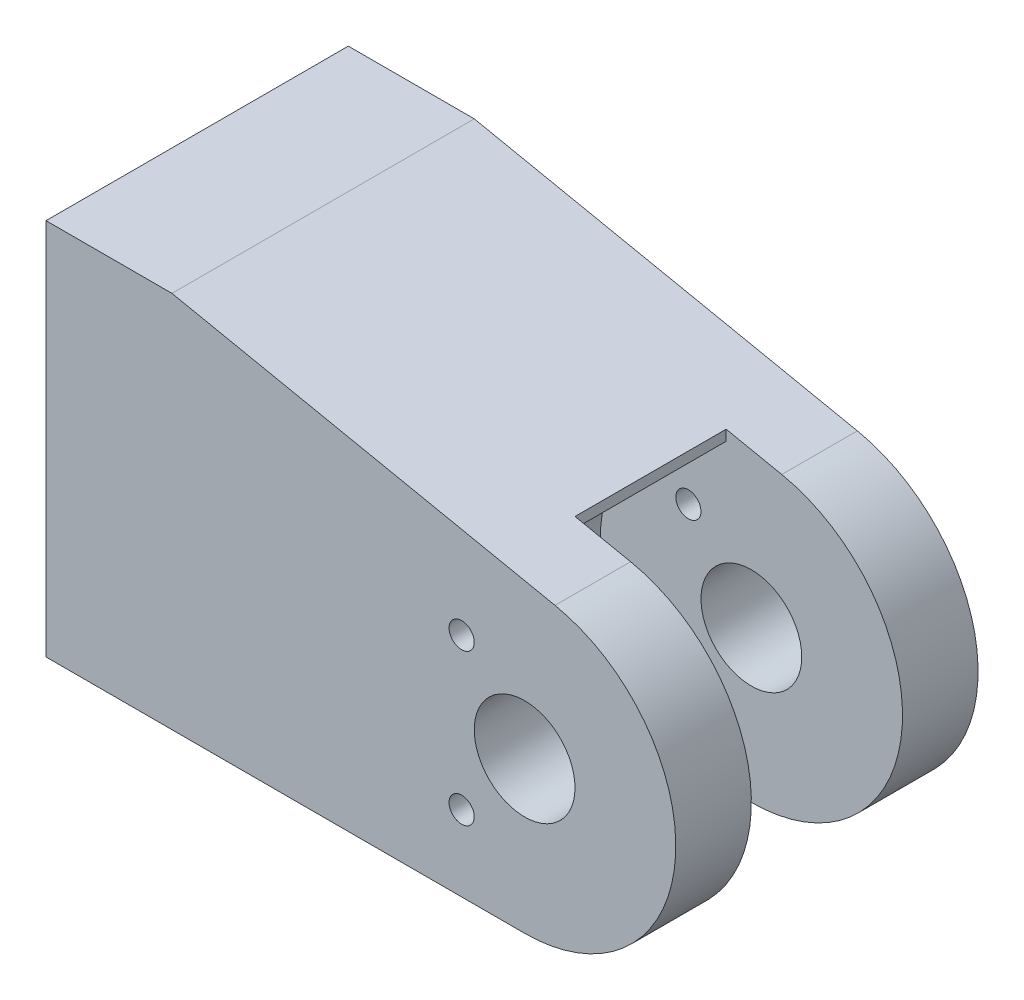
ISO-10303-21;
HEADER;
FILE_DESCRIPTION(('STEP AP214'),'2;1');
FILE_NAME('part.step','',(''),(''),'','','');
FILE_SCHEMA(('AUTOMOTIVE_DESIGN { 1 0 10303 214 1 1 1 1 }'));
ENDSEC;
DATA;
#1=APPLICATION_CONTEXT('core data for automotive mechanical design processes');
#2=APPLICATION_PROTOCOL_DEFINITION('international standard','automotive_design',2000,#1);
#3=PRODUCT_CONTEXT('',#1,'mechanical');
#4=PRODUCT('Part','Part','',(#3));
#5=PRODUCT_RELATED_PRODUCT_CATEGORY('part','',(#4));
#6=PRODUCT_DEFINITION_FORMATION('','',#4);
#7=PRODUCT_DEFINITION_CONTEXT('part definition',#1,'design');
#8=PRODUCT_DEFINITION('design','',#6,#7);
#9=PRODUCT_DEFINITION_SHAPE('','',#8);
#10=(LENGTH_UNIT() NAMED_UNIT(*) SI_UNIT(.MILLI.,.METRE.));
#11=(NAMED_UNIT(*) PLANE_ANGLE_UNIT() SI_UNIT($,.RADIAN.));
#12=(NAMED_UNIT(*) SI_UNIT($,.STERADIAN.) SOLID_ANGLE_UNIT());
#13=UNCERTAINTY_MEASURE_WITH_UNIT(LENGTH_MEASURE(1.E-05),#10,'distance_accuracy_value','');
#14=(GEOMETRIC_REPRESENTATION_CONTEXT(3) GLOBAL_UNCERTAINTY_ASSIGNED_CONTEXT((#13)) GLOBAL_UNIT_ASSIGNED_CONTEXT((#10,
#11,#12)) REPRESENTATION_CONTEXT('',''));
#15=CARTESIAN_POINT('',(0.,0.,0.));
#16=DIRECTION('',(0.,0.,1.));
#17=DIRECTION('',(1.,0.,0.));
#18=AXIS2_PLACEMENT_3D('',#15,#16,#17);
#19=CARTESIAN_POINT('',(0.,0.,6.));
#20=DIRECTION('',(0.,1.,0.));
#21=DIRECTION('',(0.,0.,1.));
#22=AXIS2_PLACEMENT_3D('',#19,#20,#21);
#23=PLANE('',#22);
#24=DIRECTION('',(1.,0.,0.));
#25=VECTOR('',#24,1.);
#26=CARTESIAN_POINT('',(18.,0.,-3.));
#27=LINE('',#26,#25);
#28=CARTESIAN_POINT('',(15.,0.,-3.));
#29=VERTEX_POINT('',#28);
#30=CARTESIAN_POINT('',(19.,0.,-3.));
#31=VERTEX_POINT('',#30);
#32=EDGE_CURVE('E161',#29,#31,#27,.T.);
#33=ORIENTED_EDGE('',*,*,#32,.F.);
#34=DIRECTION('',(0.,0.,1.));
#35=VECTOR('',#34,1.);
#36=CARTESIAN_POINT('',(15.,0.,-3.));
#37=LINE('',#36,#35);
#38=CARTESIAN_POINT('',(15.,0.,3.));
#39=VERTEX_POINT('',#38);
#40=EDGE_CURVE('E259',#29,#39,#37,.T.);
#41=ORIENTED_EDGE('',*,*,#40,.T.);
#42=DIRECTION('',(-1.,0.,0.));
#43=VECTOR('',#42,1.);
#44=CARTESIAN_POINT('',(18.,0.,3.));
#45=LINE('',#44,#43);
#46=CARTESIAN_POINT('',(19.,0.,3.));
#47=VERTEX_POINT('',#46);
#48=EDGE_CURVE('E176',#47,#39,#45,.T.);
#49=ORIENTED_EDGE('',*,*,#48,.F.);
#50=DIRECTION('',(0.,0.,-1.));
#51=VECTOR('',#50,1.);
#52=CARTESIAN_POINT('',(19.,0.,6.));
#53=LINE('',#52,#51);
#54=CARTESIAN_POINT('',(19.,0.,6.));
#55=VERTEX_POINT('',#54);
#56=EDGE_CURVE('E46',#55,#47,#53,.T.);
#57=ORIENTED_EDGE('',*,*,#56,.F.);
#58=DIRECTION('',(1.,0.,0.));
#59=VECTOR('',#58,1.);
#60=CARTESIAN_POINT('',(0.,0.,6.));
#61=LINE('',#60,#59);
#62=CARTESIAN_POINT('',(0.,0.,6.));
#63=VERTEX_POINT('',#62);
#64=EDGE_CURVE('E95',#63,#55,#61,.T.);
#65=ORIENTED_EDGE('',*,*,#64,.F.);
#66=DIRECTION('',(0.,0.,-1.));
#67=VECTOR('',#66,1.);
#68=CARTESIAN_POINT('',(0.,0.,6.));
#69=LINE('',#68,#67);
#70=CARTESIAN_POINT('',(0.,0.,-6.));
#71=VERTEX_POINT('',#70);
#72=EDGE_CURVE('E11',#63,#71,#69,.T.);
#73=ORIENTED_EDGE('',*,*,#72,.T.);
#74=DIRECTION('',(1.,0.,0.));
#75=VECTOR('',#74,1.);
#76=CARTESIAN_POINT('',(0.,0.,-6.));
#77=LINE('',#76,#75);
#78=CARTESIAN_POINT('',(19.,0.,-6.));
#79=VERTEX_POINT('',#78);
#80=EDGE_CURVE('E133',#71,#79,#77,.T.);
#81=ORIENTED_EDGE('',*,*,#80,.T.);
#82=EDGE_CURVE('E120',#31,#79,#53,.T.);
#83=ORIENTED_EDGE('',*,*,#82,.F.);
#84=EDGE_LOOP('',(#33,#41,#49,#57,#65,#73,#81,#83));
#85=FACE_BOUND('',#84,.T.);
#86=ADVANCED_FACE('F37',(#85),#23,.F.);
#87=CARTESIAN_POINT('',(19.,6.,6.));
#88=DIRECTION('',(0.,0.,-1.));
#89=DIRECTION('',(-1.,0.,0.));
#90=AXIS2_PLACEMENT_3D('',#87,#88,#89);
#91=CYLINDRICAL_SURFACE('',#90,6.);
#92=CARTESIAN_POINT('',(19.,6.,-3.));
#93=DIRECTION('',(0.,0.,1.));
#94=DIRECTION('',(1.,0.,0.));
#95=AXIS2_PLACEMENT_3D('',#92,#93,#94);
#96=CIRCLE('',#95,6.);
#97=CARTESIAN_POINT('',(20.2068788216536,11.8773670559056,-3.));
#98=VERTEX_POINT('',#97);
#99=EDGE_CURVE('E207',#31,#98,#96,.T.);
#100=ORIENTED_EDGE('',*,*,#99,.F.);
#101=ORIENTED_EDGE('',*,*,#82,.T.);
#102=CARTESIAN_POINT('',(19.,6.,-6.));
#103=DIRECTION('',(0.,0.,1.));
#104=DIRECTION('',(1.,0.,0.));
#105=AXIS2_PLACEMENT_3D('',#102,#103,#104);
#106=CIRCLE('',#105,6.);
#107=CARTESIAN_POINT('',(20.2068788216536,11.8773670559056,-6.));
#108=VERTEX_POINT('',#107);
#109=EDGE_CURVE('E137',#79,#108,#106,.T.);
#110=ORIENTED_EDGE('',*,*,#109,.T.);
#111=DIRECTION('',(0.,0.,-1.));
#112=VECTOR('',#111,1.);
#113=CARTESIAN_POINT('',(20.2068788216536,11.8773670559056,6.));
#114=LINE('',#113,#112);
#115=EDGE_CURVE('E121',#98,#108,#114,.T.);
#116=ORIENTED_EDGE('',*,*,#115,.F.);
#117=EDGE_LOOP('',(#100,#101,#110,#116));
#118=FACE_BOUND('',#117,.T.);
#119=ADVANCED_FACE('F229',(#118),#91,.T.);
#120=CARTESIAN_POINT('',(19.,6.,6.));
#121=DIRECTION('',(0.,0.,-1.));
#122=DIRECTION('',(-1.,0.,0.));
#123=AXIS2_PLACEMENT_3D('',#120,#121,#122);
#124=CYLINDRICAL_SURFACE('',#123,2.);
#125=CARTESIAN_POINT('',(19.,6.,-6.));
#126=DIRECTION('',(0.,0.,1.));
#127=DIRECTION('',(1.,0.,0.));
#128=AXIS2_PLACEMENT_3D('',#125,#126,#127);
#129=CIRCLE('',#128,2.);
#130=CARTESIAN_POINT('',(21.,6.,-6.));
#131=VERTEX_POINT('',#130);
#132=EDGE_CURVE('E153',#131,#131,#129,.T.);
#133=ORIENTED_EDGE('',*,*,#132,.F.);
#134=EDGE_LOOP('',(#133));
#135=FACE_BOUND('',#134,.T.);
#136=CARTESIAN_POINT('',(19.,6.,-3.));
#137=DIRECTION('',(0.,0.,1.));
#138=DIRECTION('',(1.,0.,0.));
#139=AXIS2_PLACEMENT_3D('',#136,#137,#138);
#140=CIRCLE('',#139,2.);
#141=CARTESIAN_POINT('',(21.,6.,-3.));
#142=VERTEX_POINT('',#141);
#143=EDGE_CURVE('E150',#142,#142,#140,.T.);
#144=ORIENTED_EDGE('',*,*,#143,.T.);
#145=EDGE_LOOP('',(#144));
#146=FACE_BOUND('',#145,.T.);
#147=ADVANCED_FACE('F285',(#135,#146),#124,.F.);
#148=CARTESIAN_POINT('',(19.,6.,6.));
#149=DIRECTION('',(0.,0.,1.));
#150=DIRECTION('',(1.,0.,0.));
#151=AXIS2_PLACEMENT_3D('',#148,#149,#150);
#152=PLANE('',#151);
#153=CARTESIAN_POINT('',(16.5,9.,6.));
#154=DIRECTION('',(0.,0.,1.));
#155=DIRECTION('',(1.,0.,0.));
#156=AXIS2_PLACEMENT_3D('',#153,#154,#155);
#157=CIRCLE('',#156,0.499999999999999);
#158=CARTESIAN_POINT('',(17.,9.,6.));
#159=VERTEX_POINT('',#158);
#160=EDGE_CURVE('E271',#159,#159,#157,.T.);
#161=ORIENTED_EDGE('',*,*,#160,.F.);
#162=EDGE_LOOP('',(#161));
#163=FACE_BOUND('',#162,.T.);
#164=CARTESIAN_POINT('',(16.5,3.,6.));
#165=DIRECTION('',(0.,0.,1.));
#166=DIRECTION('',(1.,0.,0.));
#167=AXIS2_PLACEMENT_3D('',#164,#165,#166);
#168=CIRCLE('',#167,0.499999999999999);
#169=CARTESIAN_POINT('',(17.,3.,6.));
#170=VERTEX_POINT('',#169);
#171=EDGE_CURVE('E164',#170,#170,#168,.T.);
#172=ORIENTED_EDGE('',*,*,#171,.F.);
#173=EDGE_LOOP('',(#172));
#174=FACE_BOUND('',#173,.T.);
#175=DIRECTION('',(0.,-1.,0.));
#176=VECTOR('',#175,1.);
#177=CARTESIAN_POINT('',(0.,15.,6.));
#178=LINE('',#177,#176);
#179=CARTESIAN_POINT('',(0.,15.,6.));
#180=VERTEX_POINT('',#179);
#181=EDGE_CURVE('E143',#180,#63,#178,.T.);
#182=ORIENTED_EDGE('',*,*,#181,.T.);
#183=ORIENTED_EDGE('',*,*,#64,.T.);
#184=CARTESIAN_POINT('',(19.,6.,6.));
#185=DIRECTION('',(0.,0.,1.));
#186=DIRECTION('',(1.,0.,0.));
#187=AXIS2_PLACEMENT_3D('',#184,#185,#186);
#188=CIRCLE('',#187,6.);
#189=CARTESIAN_POINT('',(20.2068788216536,11.8773670559056,6.));
#190=VERTEX_POINT('',#189);
#191=EDGE_CURVE('E101',#55,#190,#188,.T.);
#192=ORIENTED_EDGE('',*,*,#191,.T.);
#193=DIRECTION('',(-0.979561175984261,0.201146470275596,0.));
#194=VECTOR('',#193,1.);
#195=CARTESIAN_POINT('',(20.2068788216536,11.8773670559056,6.));
#196=LINE('',#195,#194);
#197=CARTESIAN_POINT('',(5.,15.,6.));
#198=VERTEX_POINT('',#197);
#199=EDGE_CURVE('E106',#190,#198,#196,.T.);
#200=ORIENTED_EDGE('',*,*,#199,.T.);
#201=DIRECTION('',(-1.,0.,0.));
#202=VECTOR('',#201,1.);
#203=CARTESIAN_POINT('',(5.,15.,6.));
#204=LINE('',#203,#202);
#205=EDGE_CURVE('E63',#198,#180,#204,.T.);
#206=ORIENTED_EDGE('',*,*,#205,.T.);
#207=EDGE_LOOP('',(#182,#183,#192,#200,#206));
#208=FACE_BOUND('',#207,.T.);
#209=CARTESIAN_POINT('',(19.,6.,6.));
#210=DIRECTION('',(0.,0.,1.));
#211=DIRECTION('',(1.,0.,0.));
#212=AXIS2_PLACEMENT_3D('',#209,#210,#211);
#213=CIRCLE('',#212,2.);
#214=CARTESIAN_POINT('',(21.,6.,6.));
#215=VERTEX_POINT('',#214);
#216=EDGE_CURVE('E134',#215,#215,#213,.T.);
#217=ORIENTED_EDGE('',*,*,#216,.F.);
#218=EDGE_LOOP('',(#217));
#219=FACE_BOUND('',#218,.T.);
#220=ADVANCED_FACE('F103',(#163,#174,#208,#219),#152,.T.);
#221=CARTESIAN_POINT('',(19.,6.,-6.));
#222=DIRECTION('',(0.,0.,1.));
#223=DIRECTION('',(1.,0.,0.));
#224=AXIS2_PLACEMENT_3D('',#221,#222,#223);
#225=PLANE('',#224);
#226=CARTESIAN_POINT('',(16.5,9.,-6.));
#227=DIRECTION('',(0.,0.,1.));
#228=DIRECTION('',(1.,0.,0.));
#229=AXIS2_PLACEMENT_3D('',#226,#227,#228);
#230=CIRCLE('',#229,0.499999999999999);
#231=CARTESIAN_POINT('',(17.,9.,-6.));
#232=VERTEX_POINT('',#231);
#233=EDGE_CURVE('E275',#232,#232,#230,.T.);
#234=ORIENTED_EDGE('',*,*,#233,.T.);
#235=EDGE_LOOP('',(#234));
#236=FACE_BOUND('',#235,.T.);
#237=CARTESIAN_POINT('',(16.5,3.,-6.));
#238=DIRECTION('',(0.,0.,1.));
#239=DIRECTION('',(1.,0.,0.));
#240=AXIS2_PLACEMENT_3D('',#237,#238,#239);
#241=CIRCLE('',#240,0.499999999999999);
#242=CARTESIAN_POINT('',(17.,3.,-6.));
#243=VERTEX_POINT('',#242);
#244=EDGE_CURVE('E157',#243,#243,#241,.T.);
#245=ORIENTED_EDGE('',*,*,#244,.T.);
#246=EDGE_LOOP('',(#245));
#247=FACE_BOUND('',#246,.T.);
#248=DIRECTION('',(0.,-1.,0.));
#249=VECTOR('',#248,1.);
#250=CARTESIAN_POINT('',(0.,15.,-6.));
#251=LINE('',#250,#249);
#252=CARTESIAN_POINT('',(0.,15.,-6.));
#253=VERTEX_POINT('',#252);
#254=EDGE_CURVE('E130',#253,#71,#251,.T.);
#255=ORIENTED_EDGE('',*,*,#254,.F.);
#256=DIRECTION('',(-1.,0.,0.));
#257=VECTOR('',#256,1.);
#258=CARTESIAN_POINT('',(5.,15.,-6.));
#259=LINE('',#258,#257);
#260=CARTESIAN_POINT('',(5.,15.,-6.));
#261=VERTEX_POINT('',#260);
#262=EDGE_CURVE('E87',#261,#253,#259,.T.);
#263=ORIENTED_EDGE('',*,*,#262,.F.);
#264=DIRECTION('',(-0.979561175984261,0.201146470275596,0.));
#265=VECTOR('',#264,1.);
#266=CARTESIAN_POINT('',(20.2068788216536,11.8773670559056,-6.));
#267=LINE('',#266,#265);
#268=EDGE_CURVE('E140',#108,#261,#267,.T.);
#269=ORIENTED_EDGE('',*,*,#268,.F.);
#270=ORIENTED_EDGE('',*,*,#109,.F.);
#271=ORIENTED_EDGE('',*,*,#80,.F.);
#272=EDGE_LOOP('',(#255,#263,#269,#270,#271));
#273=FACE_BOUND('',#272,.T.);
#274=ORIENTED_EDGE('',*,*,#132,.T.);
#275=EDGE_LOOP('',(#274));
#276=FACE_BOUND('',#275,.T.);
#277=ADVANCED_FACE('F224',(#236,#247,#273,#276),#225,.F.);
#278=CARTESIAN_POINT('',(0.,15.,6.));
#279=DIRECTION('',(1.,0.,0.));
#280=DIRECTION('',(0.,1.,0.));
#281=AXIS2_PLACEMENT_3D('',#278,#279,#280);
#282=PLANE('',#281);
#283=CARTESIAN_POINT('',(0.,4.85,-0.320000000000001));
#284=DIRECTION('',(-1.,0.,0.));
#285=DIRECTION('',(0.,-1.,0.));
#286=AXIS2_PLACEMENT_3D('',#283,#284,#285);
#287=CIRCLE('',#286,1.984375);
#288=CARTESIAN_POINT('',(0.,2.865625,-0.320000000000001));
#289=VERTEX_POINT('',#288);
#290=EDGE_CURVE('E194',#289,#289,#287,.T.);
#291=ORIENTED_EDGE('',*,*,#290,.F.);
#292=EDGE_LOOP('',(#291));
#293=FACE_BOUND('',#292,.T.);
#294=CARTESIAN_POINT('',(0.,10.85,-0.320000000000001));
#295=DIRECTION('',(-1.,0.,0.));
#296=DIRECTION('',(0.,-1.,0.));
#297=AXIS2_PLACEMENT_3D('',#294,#295,#296);
#298=CIRCLE('',#297,1.984375);
#299=CARTESIAN_POINT('',(0.,8.865625,-0.320000000000001));
#300=VERTEX_POINT('',#299);
#301=EDGE_CURVE('E198',#300,#300,#298,.T.);
#302=ORIENTED_EDGE('',*,*,#301,.F.);
#303=EDGE_LOOP('',(#302));
#304=FACE_BOUND('',#303,.T.);
#305=ORIENTED_EDGE('',*,*,#254,.T.);
#306=ORIENTED_EDGE('',*,*,#72,.F.);
#307=ORIENTED_EDGE('',*,*,#181,.F.);
#308=DIRECTION('',(0.,0.,-1.));
#309=VECTOR('',#308,1.);
#310=CARTESIAN_POINT('',(0.,15.,6.));
#311=LINE('',#310,#309);
#312=EDGE_CURVE('E126',#180,#253,#311,.T.);
#313=ORIENTED_EDGE('',*,*,#312,.T.);
#314=EDGE_LOOP('',(#305,#306,#307,#313));
#315=FACE_BOUND('',#314,.T.);
#316=ADVANCED_FACE('F39',(#293,#304,#315),#282,.F.);
#317=ORIENTED_EDGE('',*,*,#56,.T.);
#318=CARTESIAN_POINT('',(19.,6.,3.));
#319=DIRECTION('',(0.,0.,1.));
#320=DIRECTION('',(1.,0.,0.));
#321=AXIS2_PLACEMENT_3D('',#318,#319,#320);
#322=CIRCLE('',#321,6.);
#323=CARTESIAN_POINT('',(20.2068788216536,11.8773670559056,3.));
#324=VERTEX_POINT('',#323);
#325=EDGE_CURVE('E117',#47,#324,#322,.T.);
#326=ORIENTED_EDGE('',*,*,#325,.T.);
#327=EDGE_CURVE('E113',#190,#324,#114,.T.);
#328=ORIENTED_EDGE('',*,*,#327,.F.);
#329=ORIENTED_EDGE('',*,*,#191,.F.);
#330=EDGE_LOOP('',(#317,#326,#328,#329));
#331=FACE_BOUND('',#330,.T.);
#332=ADVANCED_FACE('F114',(#331),#91,.T.);
#333=CARTESIAN_POINT('',(20.2068788216536,11.8773670559056,6.));
#334=DIRECTION('',(-0.201146470275596,-0.979561175984261,0.));
#335=DIRECTION('',(0.979561175984261,-0.201146470275596,0.));
#336=AXIS2_PLACEMENT_3D('',#333,#334,#335);
#337=PLANE('',#336);
#338=ORIENTED_EDGE('',*,*,#327,.T.);
#339=DIRECTION('',(-0.979561175984261,0.201146470275596,0.));
#340=VECTOR('',#339,1.);
#341=CARTESIAN_POINT('',(20.2068788216536,11.8773670559056,3.));
#342=LINE('',#341,#340);
#343=CARTESIAN_POINT('',(18.,12.3305351644268,3.));
#344=VERTEX_POINT('',#343);
#345=EDGE_CURVE('E192',#324,#344,#342,.T.);
#346=ORIENTED_EDGE('',*,*,#345,.T.);
#347=DIRECTION('',(0.,0.,-1.));
#348=VECTOR('',#347,1.);
#349=CARTESIAN_POINT('',(18.,12.3305351644268,6.));
#350=LINE('',#349,#348);
#351=CARTESIAN_POINT('',(18.,12.3305351644268,-3.));
#352=VERTEX_POINT('',#351);
#353=EDGE_CURVE('E186',#344,#352,#350,.T.);
#354=ORIENTED_EDGE('',*,*,#353,.T.);
#355=DIRECTION('',(0.979561175984261,-0.201146470275596,0.));
#356=VECTOR('',#355,1.);
#357=CARTESIAN_POINT('',(20.2068788216536,11.8773670559056,-3.));
#358=LINE('',#357,#356);
#359=EDGE_CURVE('E189',#352,#98,#358,.T.);
#360=ORIENTED_EDGE('',*,*,#359,.T.);
#361=ORIENTED_EDGE('',*,*,#115,.T.);
#362=ORIENTED_EDGE('',*,*,#268,.T.);
#363=DIRECTION('',(0.,0.,-1.));
#364=VECTOR('',#363,1.);
#365=CARTESIAN_POINT('',(5.,15.,6.));
#366=LINE('',#365,#364);
#367=EDGE_CURVE('E124',#198,#261,#366,.T.);
#368=ORIENTED_EDGE('',*,*,#367,.F.);
#369=ORIENTED_EDGE('',*,*,#199,.F.);
#370=EDGE_LOOP('',(#338,#346,#354,#360,#361,#362,#368,#369));
#371=FACE_BOUND('',#370,.T.);
#372=ADVANCED_FACE('F123',(#371),#337,.F.);
#373=CARTESIAN_POINT('',(5.,15.,6.));
#374=DIRECTION('',(0.,-1.,0.));
#375=DIRECTION('',(0.,0.,-1.));
#376=AXIS2_PLACEMENT_3D('',#373,#374,#375);
#377=PLANE('',#376);
#378=ORIENTED_EDGE('',*,*,#262,.T.);
#379=ORIENTED_EDGE('',*,*,#312,.F.);
#380=ORIENTED_EDGE('',*,*,#205,.F.);
#381=ORIENTED_EDGE('',*,*,#367,.T.);
#382=EDGE_LOOP('',(#378,#379,#380,#381));
#383=FACE_BOUND('',#382,.T.);
#384=ADVANCED_FACE('F313',(#383),#377,.F.);
#385=CARTESIAN_POINT('',(19.,6.,3.));
#386=DIRECTION('',(0.,0.,1.));
#387=DIRECTION('',(1.,0.,0.));
#388=AXIS2_PLACEMENT_3D('',#385,#386,#387);
#389=CIRCLE('',#388,2.);
#390=CARTESIAN_POINT('',(21.,6.,3.));
#391=VERTEX_POINT('',#390);
#392=EDGE_CURVE('E147',#391,#391,#389,.T.);
#393=ORIENTED_EDGE('',*,*,#392,.F.);
#394=EDGE_LOOP('',(#393));
#395=FACE_BOUND('',#394,.T.);
#396=ORIENTED_EDGE('',*,*,#216,.T.);
#397=EDGE_LOOP('',(#396));
#398=FACE_BOUND('',#397,.T.);
#399=ADVANCED_FACE('F316',(#395,#398),#124,.F.);
#400=CARTESIAN_POINT('',(19.,6.,-3.));
#401=DIRECTION('',(0.,0.,1.));
#402=DIRECTION('',(1.,0.,0.));
#403=AXIS2_PLACEMENT_3D('',#400,#401,#402);
#404=CYLINDRICAL_SURFACE('',#403,6.);
#405=CARTESIAN_POINT('',(18.,11.9160797830996,3.));
#406=VERTEX_POINT('',#405);
#407=CARTESIAN_POINT('',(15.6717988226486,1.00769823397294,3.));
#408=VERTEX_POINT('',#407);
#409=EDGE_CURVE('E208',#406,#408,#322,.T.);
#410=ORIENTED_EDGE('',*,*,#409,.T.);
#411=DIRECTION('',(0.,0.,1.));
#412=VECTOR('',#411,1.);
#413=CARTESIAN_POINT('',(15.6717988226486,1.00769823397294,-3.));
#414=LINE('',#413,#412);
#415=CARTESIAN_POINT('',(15.6717988226486,1.00769823397294,-3.));
#416=VERTEX_POINT('',#415);
#417=EDGE_CURVE('E269',#408,#416,#414,.F.);
#418=ORIENTED_EDGE('',*,*,#417,.T.);
#419=CARTESIAN_POINT('',(18.,11.9160797830996,-3.));
#420=VERTEX_POINT('',#419);
#421=EDGE_CURVE('E151',#420,#416,#96,.T.);
#422=ORIENTED_EDGE('',*,*,#421,.F.);
#423=DIRECTION('',(0.,0.,1.));
#424=VECTOR('',#423,1.);
#425=CARTESIAN_POINT('',(18.,11.9160797830996,-3.));
#426=LINE('',#425,#424);
#427=EDGE_CURVE('E182',#420,#406,#426,.T.);
#428=ORIENTED_EDGE('',*,*,#427,.T.);
#429=EDGE_LOOP('',(#410,#418,#422,#428));
#430=FACE_BOUND('',#429,.T.);
#431=ADVANCED_FACE('F322',(#430),#404,.F.);
#432=CARTESIAN_POINT('',(19.,6.,-3.));
#433=DIRECTION('',(0.,0.,1.));
#434=DIRECTION('',(1.,0.,0.));
#435=AXIS2_PLACEMENT_3D('',#432,#433,#434);
#436=PLANE('',#435);
#437=ORIENTED_EDGE('',*,*,#421,.T.);
#438=DIRECTION('',(-0.554700196225229,-0.832050294337844,0.));
#439=VECTOR('',#438,1.);
#440=CARTESIAN_POINT('',(16.,1.5,-3.));
#441=LINE('',#440,#439);
#442=EDGE_CURVE('E260',#416,#29,#441,.T.);
#443=ORIENTED_EDGE('',*,*,#442,.T.);
#444=ORIENTED_EDGE('',*,*,#32,.T.);
#445=ORIENTED_EDGE('',*,*,#99,.T.);
#446=ORIENTED_EDGE('',*,*,#359,.F.);
#447=DIRECTION('',(0.,-1.,0.));
#448=VECTOR('',#447,1.);
#449=CARTESIAN_POINT('',(18.,15.,-3.));
#450=LINE('',#449,#448);
#451=EDGE_CURVE('E54',#352,#420,#450,.T.);
#452=ORIENTED_EDGE('',*,*,#451,.T.);
#453=EDGE_LOOP('',(#437,#443,#444,#445,#446,#452));
#454=FACE_BOUND('',#453,.T.);
#455=CARTESIAN_POINT('',(16.5,9.,-3.));
#456=DIRECTION('',(0.,0.,1.));
#457=DIRECTION('',(1.,0.,0.));
#458=AXIS2_PLACEMENT_3D('',#455,#456,#457);
#459=CIRCLE('',#458,0.499999999999999);
#460=CARTESIAN_POINT('',(17.,9.,-3.));
#461=VERTEX_POINT('',#460);
#462=EDGE_CURVE('E169',#461,#461,#459,.T.);
#463=ORIENTED_EDGE('',*,*,#462,.F.);
#464=EDGE_LOOP('',(#463));
#465=FACE_BOUND('',#464,.T.);
#466=CARTESIAN_POINT('',(16.5,3.,-3.));
#467=DIRECTION('',(0.,0.,1.));
#468=DIRECTION('',(1.,0.,0.));
#469=AXIS2_PLACEMENT_3D('',#466,#467,#468);
#470=CIRCLE('',#469,0.499999999999999);
#471=CARTESIAN_POINT('',(17.,3.,-3.));
#472=VERTEX_POINT('',#471);
#473=EDGE_CURVE('E156',#472,#472,#470,.T.);
#474=ORIENTED_EDGE('',*,*,#473,.F.);
#475=EDGE_LOOP('',(#474));
#476=FACE_BOUND('',#475,.T.);
#477=ORIENTED_EDGE('',*,*,#143,.F.);
#478=EDGE_LOOP('',(#477));
#479=FACE_BOUND('',#478,.T.);
#480=ADVANCED_FACE('F232',(#454,#465,#476,#479),#436,.T.);
#481=CARTESIAN_POINT('',(19.,6.,3.));
#482=DIRECTION('',(0.,0.,1.));
#483=DIRECTION('',(1.,0.,0.));
#484=AXIS2_PLACEMENT_3D('',#481,#482,#483);
#485=PLANE('',#484);
#486=DIRECTION('',(-0.554700196225229,-0.832050294337844,0.));
#487=VECTOR('',#486,1.);
#488=CARTESIAN_POINT('',(16.,1.5,3.));
#489=LINE('',#488,#487);
#490=EDGE_CURVE('E264',#408,#39,#489,.T.);
#491=ORIENTED_EDGE('',*,*,#490,.F.);
#492=ORIENTED_EDGE('',*,*,#409,.F.);
#493=DIRECTION('',(0.,-1.,0.));
#494=VECTOR('',#493,1.);
#495=CARTESIAN_POINT('',(18.,15.,3.));
#496=LINE('',#495,#494);
#497=EDGE_CURVE('E179',#344,#406,#496,.T.);
#498=ORIENTED_EDGE('',*,*,#497,.F.);
#499=ORIENTED_EDGE('',*,*,#345,.F.);
#500=ORIENTED_EDGE('',*,*,#325,.F.);
#501=ORIENTED_EDGE('',*,*,#48,.T.);
#502=EDGE_LOOP('',(#491,#492,#498,#499,#500,#501));
#503=FACE_BOUND('',#502,.T.);
#504=CARTESIAN_POINT('',(16.5,9.,3.));
#505=DIRECTION('',(0.,0.,1.));
#506=DIRECTION('',(1.,0.,0.));
#507=AXIS2_PLACEMENT_3D('',#504,#505,#506);
#508=CIRCLE('',#507,0.499999999999999);
#509=CARTESIAN_POINT('',(17.,9.,3.));
#510=VERTEX_POINT('',#509);
#511=EDGE_CURVE('E41',#510,#510,#508,.T.);
#512=ORIENTED_EDGE('',*,*,#511,.T.);
#513=EDGE_LOOP('',(#512));
#514=FACE_BOUND('',#513,.T.);
#515=CARTESIAN_POINT('',(16.5,3.,3.));
#516=DIRECTION('',(0.,0.,1.));
#517=DIRECTION('',(1.,0.,0.));
#518=AXIS2_PLACEMENT_3D('',#515,#516,#517);
#519=CIRCLE('',#518,0.499999999999999);
#520=CARTESIAN_POINT('',(17.,3.,3.));
#521=VERTEX_POINT('',#520);
#522=EDGE_CURVE('E154',#521,#521,#519,.T.);
#523=ORIENTED_EDGE('',*,*,#522,.T.);
#524=EDGE_LOOP('',(#523));
#525=FACE_BOUND('',#524,.T.);
#526=ORIENTED_EDGE('',*,*,#392,.T.);
#527=EDGE_LOOP('',(#526));
#528=FACE_BOUND('',#527,.T.);
#529=ADVANCED_FACE('F327',(#503,#514,#525,#528),#485,.F.);
#530=CARTESIAN_POINT('',(6.,10.85,-0.320000000000001));
#531=DIRECTION('',(-1.,0.,0.));
#532=DIRECTION('',(0.,-1.,0.));
#533=AXIS2_PLACEMENT_3D('',#530,#531,#532);
#534=CYLINDRICAL_SURFACE('',#533,1.984375);
#535=CARTESIAN_POINT('',(6.,10.85,-0.320000000000001));
#536=DIRECTION('',(-1.,0.,0.));
#537=DIRECTION('',(0.,-1.,0.));
#538=AXIS2_PLACEMENT_3D('',#535,#536,#537);
#539=CIRCLE('',#538,1.984375);
#540=CARTESIAN_POINT('',(6.,8.865625,-0.320000000000001));
#541=VERTEX_POINT('',#540);
#542=EDGE_CURVE('E201',#541,#541,#539,.T.);
#543=ORIENTED_EDGE('',*,*,#542,.F.);
#544=EDGE_LOOP('',(#543));
#545=FACE_BOUND('',#544,.T.);
#546=ORIENTED_EDGE('',*,*,#301,.T.);
#547=EDGE_LOOP('',(#546));
#548=FACE_BOUND('',#547,.T.);
#549=ADVANCED_FACE('F330',(#545,#548),#534,.F.);
#550=CARTESIAN_POINT('',(6.,10.85,-0.320000000000001));
#551=DIRECTION('',(-1.,0.,0.));
#552=DIRECTION('',(0.,-1.,0.));
#553=AXIS2_PLACEMENT_3D('',#550,#551,#552);
#554=PLANE('',#553);
#555=ORIENTED_EDGE('',*,*,#542,.T.);
#556=EDGE_LOOP('',(#555));
#557=FACE_BOUND('',#556,.T.);
#558=ADVANCED_FACE('F336',(#557),#554,.T.);
#559=CARTESIAN_POINT('',(6.,4.85,-0.320000000000001));
#560=DIRECTION('',(-1.,0.,0.));
#561=DIRECTION('',(0.,-1.,0.));
#562=AXIS2_PLACEMENT_3D('',#559,#560,#561);
#563=CYLINDRICAL_SURFACE('',#562,1.984375);
#564=CARTESIAN_POINT('',(6.,4.85,-0.320000000000001));
#565=DIRECTION('',(-1.,0.,0.));
#566=DIRECTION('',(0.,-1.,0.));
#567=AXIS2_PLACEMENT_3D('',#564,#565,#566);
#568=CIRCLE('',#567,1.984375);
#569=CARTESIAN_POINT('',(6.,2.865625,-0.320000000000001));
#570=VERTEX_POINT('',#569);
#571=EDGE_CURVE('E195',#570,#570,#568,.T.);
#572=ORIENTED_EDGE('',*,*,#571,.F.);
#573=EDGE_LOOP('',(#572));
#574=FACE_BOUND('',#573,.T.);
#575=ORIENTED_EDGE('',*,*,#290,.T.);
#576=EDGE_LOOP('',(#575));
#577=FACE_BOUND('',#576,.T.);
#578=ADVANCED_FACE('F340',(#574,#577),#563,.F.);
#579=CARTESIAN_POINT('',(6.,4.85,-0.320000000000001));
#580=DIRECTION('',(-1.,0.,0.));
#581=DIRECTION('',(0.,-1.,0.));
#582=AXIS2_PLACEMENT_3D('',#579,#580,#581);
#583=PLANE('',#582);
#584=ORIENTED_EDGE('',*,*,#571,.T.);
#585=EDGE_LOOP('',(#584));
#586=FACE_BOUND('',#585,.T.);
#587=ADVANCED_FACE('F300',(#586),#583,.T.);
#588=CARTESIAN_POINT('',(18.,15.,3.));
#589=DIRECTION('',(-1.,0.,0.));
#590=DIRECTION('',(0.,0.,1.));
#591=AXIS2_PLACEMENT_3D('',#588,#589,#590);
#592=PLANE('',#591);
#593=ORIENTED_EDGE('',*,*,#497,.T.);
#594=ORIENTED_EDGE('',*,*,#427,.F.);
#595=ORIENTED_EDGE('',*,*,#451,.F.);
#596=ORIENTED_EDGE('',*,*,#353,.F.);
#597=EDGE_LOOP('',(#593,#594,#595,#596));
#598=FACE_BOUND('',#597,.T.);
#599=ADVANCED_FACE('F293',(#598),#592,.F.);
#600=CARTESIAN_POINT('',(16.5,3.,-6.));
#601=DIRECTION('',(0.,0.,1.));
#602=DIRECTION('',(1.,0.,0.));
#603=AXIS2_PLACEMENT_3D('',#600,#601,#602);
#604=CYLINDRICAL_SURFACE('',#603,0.499999999999999);
#605=ORIENTED_EDGE('',*,*,#171,.T.);
#606=EDGE_LOOP('',(#605));
#607=FACE_BOUND('',#606,.T.);
#608=ORIENTED_EDGE('',*,*,#522,.F.);
#609=EDGE_LOOP('',(#608));
#610=FACE_BOUND('',#609,.T.);
#611=ADVANCED_FACE('F289',(#607,#610),#604,.F.);
#612=ORIENTED_EDGE('',*,*,#473,.T.);
#613=EDGE_LOOP('',(#612));
#614=FACE_BOUND('',#613,.T.);
#615=ORIENTED_EDGE('',*,*,#244,.F.);
#616=EDGE_LOOP('',(#615));
#617=FACE_BOUND('',#616,.T.);
#618=ADVANCED_FACE('F292',(#614,#617),#604,.F.);
#619=CARTESIAN_POINT('',(16.5,9.,-6.));
#620=DIRECTION('',(0.,0.,1.));
#621=DIRECTION('',(1.,0.,0.));
#622=AXIS2_PLACEMENT_3D('',#619,#620,#621);
#623=CYLINDRICAL_SURFACE('',#622,0.499999999999999);
#624=ORIENTED_EDGE('',*,*,#160,.T.);
#625=EDGE_LOOP('',(#624));
#626=FACE_BOUND('',#625,.T.);
#627=ORIENTED_EDGE('',*,*,#511,.F.);
#628=EDGE_LOOP('',(#627));
#629=FACE_BOUND('',#628,.T.);
#630=ADVANCED_FACE('F280',(#626,#629),#623,.F.);
#631=ORIENTED_EDGE('',*,*,#462,.T.);
#632=EDGE_LOOP('',(#631));
#633=FACE_BOUND('',#632,.T.);
#634=ORIENTED_EDGE('',*,*,#233,.F.);
#635=EDGE_LOOP('',(#634));
#636=FACE_BOUND('',#635,.T.);
#637=ADVANCED_FACE('F454',(#633,#636),#623,.F.);
#638=CARTESIAN_POINT('',(16.,1.5,-3.));
#639=DIRECTION('',(-0.832050294337843,0.554700196225229,0.));
#640=DIRECTION('',(-0.554700196225229,-0.832050294337844,0.));
#641=AXIS2_PLACEMENT_3D('',#638,#639,#640);
#642=PLANE('',#641);
#643=ORIENTED_EDGE('',*,*,#490,.T.);
#644=ORIENTED_EDGE('',*,*,#40,.F.);
#645=ORIENTED_EDGE('',*,*,#442,.F.);
#646=ORIENTED_EDGE('',*,*,#417,.F.);
#647=EDGE_LOOP('',(#643,#644,#645,#646));
#648=FACE_BOUND('',#647,.T.);
#649=ADVANCED_FACE('F267',(#648),#642,.F.);
#650=CLOSED_SHELL('',(#86,#119,#147,#220,#277,#316,#332,#372,#384,#399,#431,#480,#529,#549,#558,
#578,#587,#599,#611,#618,#630,#637,#649));
#651=MANIFOLD_SOLID_BREP('B2',#650);
#652=ADVANCED_BREP_SHAPE_REPRESENTATION('',(#18,#651),#14);
#653=SHAPE_DEFINITION_REPRESENTATION(#9,#652);
ENDSEC;
END-ISO-10303-21;
